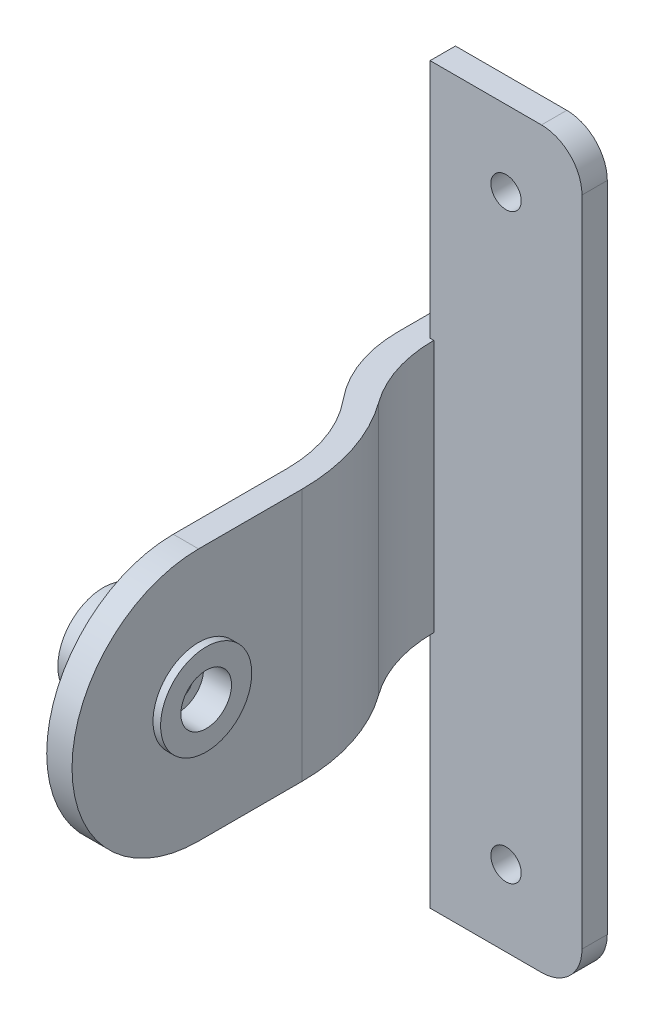
ISO-10303-21;
HEADER;
FILE_DESCRIPTION(('STEP AP214'),'2;1');
FILE_NAME('part.step','',(''),(''),'','','');
FILE_SCHEMA(('AUTOMOTIVE_DESIGN { 1 0 10303 214 1 1 1 1 }'));
ENDSEC;
DATA;
#1=APPLICATION_CONTEXT('core data for automotive mechanical design processes');
#2=APPLICATION_PROTOCOL_DEFINITION('international standard','automotive_design',2000,#1);
#3=PRODUCT_CONTEXT('',#1,'mechanical');
#4=PRODUCT('Part','Part','',(#3));
#5=PRODUCT_RELATED_PRODUCT_CATEGORY('part','',(#4));
#6=PRODUCT_DEFINITION_FORMATION('','',#4);
#7=PRODUCT_DEFINITION_CONTEXT('part definition',#1,'design');
#8=PRODUCT_DEFINITION('design','',#6,#7);
#9=PRODUCT_DEFINITION_SHAPE('','',#8);
#10=(LENGTH_UNIT() NAMED_UNIT(*) SI_UNIT(.MILLI.,.METRE.));
#11=(NAMED_UNIT(*) PLANE_ANGLE_UNIT() SI_UNIT($,.RADIAN.));
#12=(NAMED_UNIT(*) SI_UNIT($,.STERADIAN.) SOLID_ANGLE_UNIT());
#13=UNCERTAINTY_MEASURE_WITH_UNIT(LENGTH_MEASURE(1.E-05),#10,'distance_accuracy_value','');
#14=(GEOMETRIC_REPRESENTATION_CONTEXT(3) GLOBAL_UNCERTAINTY_ASSIGNED_CONTEXT((#13)) GLOBAL_UNIT_ASSIGNED_CONTEXT((#10,
#11,#12)) REPRESENTATION_CONTEXT('',''));
#15=CARTESIAN_POINT('',(0.,0.,0.));
#16=DIRECTION('',(0.,0.,1.));
#17=DIRECTION('',(1.,0.,0.));
#18=AXIS2_PLACEMENT_3D('',#15,#16,#17);
#19=CARTESIAN_POINT('',(-16.5626357879326,-12.5,-10.229605827828));
#20=DIRECTION('',(0.,-1.,0.));
#21=DIRECTION('',(0.,0.,-1.));
#22=AXIS2_PLACEMENT_3D('',#19,#20,#21);
#23=PLANE('',#22);
#24=DIRECTION('',(-1.,0.,0.));
#25=VECTOR('',#24,1.);
#26=CARTESIAN_POINT('',(-6.22117269606802,-12.5,-31.95));
#27=LINE('',#26,#25);
#28=CARTESIAN_POINT('',(-4.08117269606801,-12.5,-31.95));
#29=VERTEX_POINT('',#28);
#30=CARTESIAN_POINT('',(-6.22117269606802,-12.5,-31.95));
#31=VERTEX_POINT('',#30);
#32=EDGE_CURVE('E12',#29,#31,#27,.T.);
#33=ORIENTED_EDGE('',*,*,#32,.F.);
#34=DIRECTION('',(0.,0.,-1.));
#35=VECTOR('',#34,1.);
#36=CARTESIAN_POINT('',(-4.08117269606801,-12.5,-29.45));
#37=LINE('',#36,#35);
#38=CARTESIAN_POINT('',(-4.08117269606801,-12.5,-29.45));
#39=VERTEX_POINT('',#38);
#40=EDGE_CURVE('E220',#39,#29,#37,.T.);
#41=ORIENTED_EDGE('',*,*,#40,.F.);
#42=DIRECTION('',(-1.,0.,0.));
#43=VECTOR('',#42,1.);
#44=CARTESIAN_POINT('',(10.918827303932,-12.5,-29.45));
#45=LINE('',#44,#43);
#46=CARTESIAN_POINT('',(-3.72117269606802,-12.5,-29.45));
#47=VERTEX_POINT('',#46);
#48=EDGE_CURVE('E193',#47,#39,#45,.T.);
#49=ORIENTED_EDGE('',*,*,#48,.F.);
#50=CARTESIAN_POINT('',(10.0176070839933,-12.5,-29.45));
#51=DIRECTION('',(0.,-1.,0.));
#52=DIRECTION('',(0.,0.,1.));
#53=AXIS2_PLACEMENT_3D('',#50,#51,#52);
#54=CIRCLE('',#53,13.7387797800613);
#55=CARTESIAN_POINT('',(-1.1154521756278,-12.5,-21.3995924720058));
#56=VERTEX_POINT('',#55);
#57=EDGE_CURVE('E320',#56,#47,#54,.T.);
#58=ORIENTED_EDGE('',*,*,#57,.F.);
#59=CARTESIAN_POINT('',(-16.5626357879326,-12.5,-10.229605827828));
#60=DIRECTION('',(0.,1.,0.));
#61=DIRECTION('',(0.,0.,-1.));
#62=AXIS2_PLACEMENT_3D('',#59,#60,#61);
#63=CIRCLE('',#62,19.0626357879326);
#64=CARTESIAN_POINT('',(2.5,-12.5,-10.229605827828));
#65=VERTEX_POINT('',#64);
#66=EDGE_CURVE('E317',#65,#56,#63,.T.);
#67=ORIENTED_EDGE('',*,*,#66,.F.);
#68=DIRECTION('',(0.,0.,-1.));
#69=VECTOR('',#68,1.);
#70=CARTESIAN_POINT('',(2.5,-12.5,-7.72960582782795));
#71=LINE('',#70,#69);
#72=CARTESIAN_POINT('',(2.5,-12.5,0.));
#73=VERTEX_POINT('',#72);
#74=EDGE_CURVE('E282',#73,#65,#71,.T.);
#75=ORIENTED_EDGE('',*,*,#74,.F.);
#76=DIRECTION('',(-1.,0.,0.));
#77=VECTOR('',#76,1.);
#78=CARTESIAN_POINT('',(2.5,-12.5,0.));
#79=LINE('',#78,#77);
#80=CARTESIAN_POINT('',(0.,-12.5,0.));
#81=VERTEX_POINT('',#80);
#82=EDGE_CURVE('E252',#73,#81,#79,.T.);
#83=ORIENTED_EDGE('',*,*,#82,.T.);
#84=DIRECTION('',(0.,0.,1.));
#85=VECTOR('',#84,1.);
#86=CARTESIAN_POINT('',(0.,-12.5,-11.229605827828));
#87=LINE('',#86,#85);
#88=CARTESIAN_POINT('',(0.,-12.5,-11.229605827828));
#89=VERTEX_POINT('',#88);
#90=EDGE_CURVE('E293',#89,#81,#87,.T.);
#91=ORIENTED_EDGE('',*,*,#90,.F.);
#92=CARTESIAN_POINT('',(-13.6359802036032,-12.5,-11.229605827828));
#93=DIRECTION('',(0.,-1.,0.));
#94=DIRECTION('',(0.,0.,-1.));
#95=AXIS2_PLACEMENT_3D('',#92,#93,#94);
#96=CIRCLE('',#95,13.6359802036032);
#97=CARTESIAN_POINT('',(-3.1484631025778,-12.5,-19.9446469160133));
#98=VERTEX_POINT('',#97);
#99=EDGE_CURVE('E330',#98,#89,#96,.T.);
#100=ORIENTED_EDGE('',*,*,#99,.F.);
#101=CARTESIAN_POINT('',(7.08671938434082,-12.5,-28.45));
#102=DIRECTION('',(0.,1.,0.));
#103=DIRECTION('',(0.,0.,-1.));
#104=AXIS2_PLACEMENT_3D('',#101,#102,#103);
#105=CIRCLE('',#104,13.3078920804088);
#106=CARTESIAN_POINT('',(-6.22117269606802,-12.5,-28.45));
#107=VERTEX_POINT('',#106);
#108=EDGE_CURVE('E327',#107,#98,#105,.T.);
#109=ORIENTED_EDGE('',*,*,#108,.F.);
#110=DIRECTION('',(0.,0.,1.));
#111=VECTOR('',#110,1.);
#112=CARTESIAN_POINT('',(-6.22117269606802,-12.5,-31.95));
#113=LINE('',#112,#111);
#114=EDGE_CURVE('E323',#31,#107,#113,.T.);
#115=ORIENTED_EDGE('',*,*,#114,.F.);
#116=EDGE_LOOP('',(#33,#41,#49,#58,#67,#75,#83,#91,#100,#109,#115));
#117=FACE_BOUND('',#116,.T.);
#118=ADVANCED_FACE('F45',(#117),#23,.T.);
#119=CARTESIAN_POINT('',(2.5,12.5,-7.72960582782795));
#120=DIRECTION('',(-1.,0.,0.));
#121=DIRECTION('',(0.,0.,1.));
#122=AXIS2_PLACEMENT_3D('',#119,#120,#121);
#123=PLANE('',#122);
#124=ORIENTED_EDGE('',*,*,#74,.T.);
#125=DIRECTION('',(0.,-1.,0.));
#126=VECTOR('',#125,1.);
#127=CARTESIAN_POINT('',(2.5,12.5,-10.229605827828));
#128=LINE('',#127,#126);
#129=CARTESIAN_POINT('',(2.5,12.5,-10.229605827828));
#130=VERTEX_POINT('',#129);
#131=EDGE_CURVE('E49',#130,#65,#128,.T.);
#132=ORIENTED_EDGE('',*,*,#131,.F.);
#133=DIRECTION('',(0.,0.,-1.));
#134=VECTOR('',#133,1.);
#135=CARTESIAN_POINT('',(2.5,12.5,-7.72960582782795));
#136=LINE('',#135,#134);
#137=CARTESIAN_POINT('',(2.5,12.5,0.));
#138=VERTEX_POINT('',#137);
#139=EDGE_CURVE('E289',#138,#130,#136,.T.);
#140=ORIENTED_EDGE('',*,*,#139,.F.);
#141=CARTESIAN_POINT('',(2.5,0.,0.));
#142=DIRECTION('',(1.,0.,0.));
#143=DIRECTION('',(0.,0.,-1.));
#144=AXIS2_PLACEMENT_3D('',#141,#142,#143);
#145=CIRCLE('',#144,12.5);
#146=EDGE_CURVE('E240',#138,#73,#145,.T.);
#147=ORIENTED_EDGE('',*,*,#146,.T.);
#148=EDGE_LOOP('',(#124,#132,#140,#147));
#149=FACE_BOUND('',#148,.T.);
#150=CARTESIAN_POINT('',(2.5,0.,0.));
#151=DIRECTION('',(1.,0.,0.));
#152=DIRECTION('',(0.,0.,-1.));
#153=AXIS2_PLACEMENT_3D('',#150,#151,#152);
#154=CIRCLE('',#153,4.5);
#155=CARTESIAN_POINT('',(2.5,0.,-4.5));
#156=VERTEX_POINT('',#155);
#157=EDGE_CURVE('E278',#156,#156,#154,.T.);
#158=ORIENTED_EDGE('',*,*,#157,.F.);
#159=EDGE_LOOP('',(#158));
#160=FACE_BOUND('',#159,.T.);
#161=ADVANCED_FACE('F47',(#149,#160),#123,.F.);
#162=CARTESIAN_POINT('',(-16.5626357879326,12.5,-10.229605827828));
#163=DIRECTION('',(0.,-1.,0.));
#164=DIRECTION('',(0.,0.,-1.));
#165=AXIS2_PLACEMENT_3D('',#162,#163,#164);
#166=CYLINDRICAL_SURFACE('',#165,19.0626357879326);
#167=ORIENTED_EDGE('',*,*,#66,.T.);
#168=DIRECTION('',(0.,-1.,0.));
#169=VECTOR('',#168,1.);
#170=CARTESIAN_POINT('',(-1.1154521756278,12.5,-21.3995924720058));
#171=LINE('',#170,#169);
#172=CARTESIAN_POINT('',(-1.1154521756278,12.5,-21.3995924720058));
#173=VERTEX_POINT('',#172);
#174=EDGE_CURVE('E353',#173,#56,#171,.T.);
#175=ORIENTED_EDGE('',*,*,#174,.F.);
#176=CARTESIAN_POINT('',(-16.5626357879326,12.5,-10.229605827828));
#177=DIRECTION('',(0.,1.,0.));
#178=DIRECTION('',(0.,0.,-1.));
#179=AXIS2_PLACEMENT_3D('',#176,#177,#178);
#180=CIRCLE('',#179,19.0626357879326);
#181=EDGE_CURVE('E292',#130,#173,#180,.T.);
#182=ORIENTED_EDGE('',*,*,#181,.F.);
#183=ORIENTED_EDGE('',*,*,#131,.T.);
#184=EDGE_LOOP('',(#167,#175,#182,#183));
#185=FACE_BOUND('',#184,.T.);
#186=ADVANCED_FACE('F365',(#185),#166,.T.);
#187=CARTESIAN_POINT('',(10.0176070839933,12.5,-29.45));
#188=DIRECTION('',(0.,-1.,0.));
#189=DIRECTION('',(0.,0.,-1.));
#190=AXIS2_PLACEMENT_3D('',#187,#188,#189);
#191=CYLINDRICAL_SURFACE('',#190,13.7387797800613);
#192=ORIENTED_EDGE('',*,*,#57,.T.);
#193=DIRECTION('',(0.,-1.,0.));
#194=VECTOR('',#193,1.);
#195=CARTESIAN_POINT('',(-3.72117269606802,12.5,-29.45));
#196=LINE('',#195,#194);
#197=CARTESIAN_POINT('',(-3.72117269606802,12.5,-29.45));
#198=VERTEX_POINT('',#197);
#199=EDGE_CURVE('E350',#198,#47,#196,.T.);
#200=ORIENTED_EDGE('',*,*,#199,.F.);
#201=CARTESIAN_POINT('',(10.0176070839933,12.5,-29.45));
#202=DIRECTION('',(0.,-1.,0.));
#203=DIRECTION('',(0.,0.,1.));
#204=AXIS2_PLACEMENT_3D('',#201,#202,#203);
#205=CIRCLE('',#204,13.7387797800613);
#206=EDGE_CURVE('E296',#173,#198,#205,.T.);
#207=ORIENTED_EDGE('',*,*,#206,.F.);
#208=ORIENTED_EDGE('',*,*,#174,.T.);
#209=EDGE_LOOP('',(#192,#200,#207,#208));
#210=FACE_BOUND('',#209,.T.);
#211=ADVANCED_FACE('F376',(#210),#191,.F.);
#212=CARTESIAN_POINT('',(-6.22117269606802,12.5,-31.95));
#213=DIRECTION('',(0.,0.,1.));
#214=DIRECTION('',(1.,0.,0.));
#215=AXIS2_PLACEMENT_3D('',#212,#213,#214);
#216=PLANE('',#215);
#217=CARTESIAN_POINT('',(3.41882730393199,-28.7500000000001,-31.95));
#218=DIRECTION('',(0.,0.,1.));
#219=DIRECTION('',(-1.,0.,0.));
#220=AXIS2_PLACEMENT_3D('',#217,#218,#219);
#221=CIRCLE('',#220,1.5);
#222=CARTESIAN_POINT('',(1.91882730393199,-28.7500000000001,-31.95));
#223=VERTEX_POINT('',#222);
#224=EDGE_CURVE('E449',#223,#223,#221,.T.);
#225=ORIENTED_EDGE('',*,*,#224,.T.);
#226=EDGE_LOOP('',(#225));
#227=FACE_BOUND('',#226,.T.);
#228=CARTESIAN_POINT('',(3.41882730393199,28.7500000000001,-31.95));
#229=DIRECTION('',(0.,0.,-1.));
#230=DIRECTION('',(-1.,0.,0.));
#231=AXIS2_PLACEMENT_3D('',#228,#229,#230);
#232=CIRCLE('',#231,1.5);
#233=CARTESIAN_POINT('',(1.91882730393199,28.7500000000001,-31.95));
#234=VERTEX_POINT('',#233);
#235=EDGE_CURVE('E440',#234,#234,#232,.T.);
#236=ORIENTED_EDGE('',*,*,#235,.F.);
#237=EDGE_LOOP('',(#236));
#238=FACE_BOUND('',#237,.T.);
#239=DIRECTION('',(0.,-1.,0.));
#240=VECTOR('',#239,1.);
#241=CARTESIAN_POINT('',(10.918827303932,12.5,-31.95));
#242=LINE('',#241,#240);
#243=CARTESIAN_POINT('',(10.918827303932,32.25,-31.95));
#244=VERTEX_POINT('',#243);
#245=CARTESIAN_POINT('',(10.918827303932,-32.25,-31.95));
#246=VERTEX_POINT('',#245);
#247=EDGE_CURVE('E174',#244,#246,#242,.T.);
#248=ORIENTED_EDGE('',*,*,#247,.T.);
#249=CARTESIAN_POINT('',(6.91882730393198,-32.25,-31.95));
#250=DIRECTION('',(0.,0.,1.));
#251=DIRECTION('',(-1.,0.,0.));
#252=AXIS2_PLACEMENT_3D('',#249,#250,#251);
#253=CIRCLE('',#252,4.);
#254=CARTESIAN_POINT('',(6.91882730393198,-36.25,-31.95));
#255=VERTEX_POINT('',#254);
#256=EDGE_CURVE('E190',#255,#246,#253,.T.);
#257=ORIENTED_EDGE('',*,*,#256,.F.);
#258=DIRECTION('',(1.,0.,0.));
#259=VECTOR('',#258,1.);
#260=CARTESIAN_POINT('',(-4.08117269606801,-36.25,-31.95));
#261=LINE('',#260,#259);
#262=CARTESIAN_POINT('',(-4.08117269606801,-36.25,-31.95));
#263=VERTEX_POINT('',#262);
#264=EDGE_CURVE('E417',#263,#255,#261,.T.);
#265=ORIENTED_EDGE('',*,*,#264,.F.);
#266=DIRECTION('',(0.,-1.,0.));
#267=VECTOR('',#266,1.);
#268=CARTESIAN_POINT('',(-4.08117269606801,-12.5,-31.95));
#269=LINE('',#268,#267);
#270=EDGE_CURVE('E185',#29,#263,#269,.T.);
#271=ORIENTED_EDGE('',*,*,#270,.F.);
#272=ORIENTED_EDGE('',*,*,#32,.T.);
#273=DIRECTION('',(0.,-1.,0.));
#274=VECTOR('',#273,1.);
#275=CARTESIAN_POINT('',(-6.22117269606802,12.5,-31.95));
#276=LINE('',#275,#274);
#277=CARTESIAN_POINT('',(-6.22117269606802,12.5,-31.95));
#278=VERTEX_POINT('',#277);
#279=EDGE_CURVE('E346',#278,#31,#276,.T.);
#280=ORIENTED_EDGE('',*,*,#279,.F.);
#281=DIRECTION('',(-1.,0.,0.));
#282=VECTOR('',#281,1.);
#283=CARTESIAN_POINT('',(-6.22117269606802,12.5,-31.95));
#284=LINE('',#283,#282);
#285=CARTESIAN_POINT('',(-4.08117269606801,12.5,-31.95));
#286=VERTEX_POINT('',#285);
#287=EDGE_CURVE('E299',#286,#278,#284,.T.);
#288=ORIENTED_EDGE('',*,*,#287,.F.);
#289=DIRECTION('',(0.,1.,0.));
#290=VECTOR('',#289,1.);
#291=CARTESIAN_POINT('',(-4.08117269606801,28.75,-31.95));
#292=LINE('',#291,#290);
#293=CARTESIAN_POINT('',(-4.08117269606801,36.25,-31.95));
#294=VERTEX_POINT('',#293);
#295=EDGE_CURVE('E215',#286,#294,#292,.T.);
#296=ORIENTED_EDGE('',*,*,#295,.T.);
#297=DIRECTION('',(1.,0.,0.));
#298=VECTOR('',#297,1.);
#299=CARTESIAN_POINT('',(3.67882730393198,36.25,-31.95));
#300=LINE('',#299,#298);
#301=CARTESIAN_POINT('',(6.91882730393198,36.25,-31.95));
#302=VERTEX_POINT('',#301);
#303=EDGE_CURVE('E219',#294,#302,#300,.T.);
#304=ORIENTED_EDGE('',*,*,#303,.T.);
#305=CARTESIAN_POINT('',(6.91882730393198,32.25,-31.95));
#306=DIRECTION('',(0.,0.,-1.));
#307=DIRECTION('',(-1.,0.,0.));
#308=AXIS2_PLACEMENT_3D('',#305,#306,#307);
#309=CIRCLE('',#308,4.);
#310=EDGE_CURVE('E206',#302,#244,#309,.T.);
#311=ORIENTED_EDGE('',*,*,#310,.T.);
#312=EDGE_LOOP('',(#248,#257,#265,#271,#272,#280,#288,#296,#304,#311));
#313=FACE_BOUND('',#312,.T.);
#314=ADVANCED_FACE('F389',(#227,#238,#313),#216,.F.);
#315=CARTESIAN_POINT('',(-6.22117269606802,12.5,-31.95));
#316=DIRECTION('',(1.,0.,0.));
#317=DIRECTION('',(0.,0.,-1.));
#318=AXIS2_PLACEMENT_3D('',#315,#316,#317);
#319=PLANE('',#318);
#320=ORIENTED_EDGE('',*,*,#114,.T.);
#321=DIRECTION('',(0.,-1.,0.));
#322=VECTOR('',#321,1.);
#323=CARTESIAN_POINT('',(-6.22117269606802,12.5,-28.45));
#324=LINE('',#323,#322);
#325=CARTESIAN_POINT('',(-6.22117269606802,12.5,-28.45));
#326=VERTEX_POINT('',#325);
#327=EDGE_CURVE('E342',#326,#107,#324,.T.);
#328=ORIENTED_EDGE('',*,*,#327,.F.);
#329=DIRECTION('',(0.,0.,1.));
#330=VECTOR('',#329,1.);
#331=CARTESIAN_POINT('',(-6.22117269606802,12.5,-31.95));
#332=LINE('',#331,#330);
#333=EDGE_CURVE('E302',#278,#326,#332,.T.);
#334=ORIENTED_EDGE('',*,*,#333,.F.);
#335=ORIENTED_EDGE('',*,*,#279,.T.);
#336=EDGE_LOOP('',(#320,#328,#334,#335));
#337=FACE_BOUND('',#336,.T.);
#338=ADVANCED_FACE('F397',(#337),#319,.F.);
#339=CARTESIAN_POINT('',(7.08671938434082,12.5,-28.45));
#340=DIRECTION('',(0.,-1.,0.));
#341=DIRECTION('',(0.,0.,-1.));
#342=AXIS2_PLACEMENT_3D('',#339,#340,#341);
#343=CYLINDRICAL_SURFACE('',#342,13.3078920804088);
#344=ORIENTED_EDGE('',*,*,#108,.T.);
#345=DIRECTION('',(0.,-1.,0.));
#346=VECTOR('',#345,1.);
#347=CARTESIAN_POINT('',(-3.1484631025778,12.5,-19.9446469160133));
#348=LINE('',#347,#346);
#349=CARTESIAN_POINT('',(-3.1484631025778,12.5,-19.9446469160133));
#350=VERTEX_POINT('',#349);
#351=EDGE_CURVE('E338',#350,#98,#348,.T.);
#352=ORIENTED_EDGE('',*,*,#351,.F.);
#353=CARTESIAN_POINT('',(7.08671938434082,12.5,-28.45));
#354=DIRECTION('',(0.,1.,0.));
#355=DIRECTION('',(0.,0.,-1.));
#356=AXIS2_PLACEMENT_3D('',#353,#354,#355);
#357=CIRCLE('',#356,13.3078920804088);
#358=EDGE_CURVE('E305',#326,#350,#357,.T.);
#359=ORIENTED_EDGE('',*,*,#358,.F.);
#360=ORIENTED_EDGE('',*,*,#327,.T.);
#361=EDGE_LOOP('',(#344,#352,#359,#360));
#362=FACE_BOUND('',#361,.T.);
#363=ADVANCED_FACE('F401',(#362),#343,.T.);
#364=CARTESIAN_POINT('',(-13.6359802036032,12.5,-11.229605827828));
#365=DIRECTION('',(0.,-1.,0.));
#366=DIRECTION('',(0.,0.,-1.));
#367=AXIS2_PLACEMENT_3D('',#364,#365,#366);
#368=CYLINDRICAL_SURFACE('',#367,13.6359802036032);
#369=ORIENTED_EDGE('',*,*,#99,.T.);
#370=DIRECTION('',(0.,-1.,0.));
#371=VECTOR('',#370,1.);
#372=CARTESIAN_POINT('',(0.,12.5,-11.229605827828));
#373=LINE('',#372,#371);
#374=CARTESIAN_POINT('',(0.,12.5,-11.229605827828));
#375=VERTEX_POINT('',#374);
#376=EDGE_CURVE('E314',#375,#89,#373,.T.);
#377=ORIENTED_EDGE('',*,*,#376,.F.);
#378=CARTESIAN_POINT('',(-13.6359802036032,12.5,-11.229605827828));
#379=DIRECTION('',(0.,-1.,0.));
#380=DIRECTION('',(0.,0.,-1.));
#381=AXIS2_PLACEMENT_3D('',#378,#379,#380);
#382=CIRCLE('',#381,13.6359802036032);
#383=EDGE_CURVE('E308',#350,#375,#382,.T.);
#384=ORIENTED_EDGE('',*,*,#383,.F.);
#385=ORIENTED_EDGE('',*,*,#351,.T.);
#386=EDGE_LOOP('',(#369,#377,#384,#385));
#387=FACE_BOUND('',#386,.T.);
#388=ADVANCED_FACE('F406',(#387),#368,.F.);
#389=CARTESIAN_POINT('',(0.,12.5,-11.229605827828));
#390=DIRECTION('',(1.,0.,0.));
#391=DIRECTION('',(0.,0.,-1.));
#392=AXIS2_PLACEMENT_3D('',#389,#390,#391);
#393=PLANE('',#392);
#394=CARTESIAN_POINT('',(0.,0.,0.));
#395=DIRECTION('',(1.,0.,0.));
#396=DIRECTION('',(0.,0.,-1.));
#397=AXIS2_PLACEMENT_3D('',#394,#395,#396);
#398=CIRCLE('',#397,12.5);
#399=CARTESIAN_POINT('',(0.,12.5,0.));
#400=VERTEX_POINT('',#399);
#401=EDGE_CURVE('E245',#400,#81,#398,.T.);
#402=ORIENTED_EDGE('',*,*,#401,.F.);
#403=DIRECTION('',(0.,0.,1.));
#404=VECTOR('',#403,1.);
#405=CARTESIAN_POINT('',(0.,12.5,-11.229605827828));
#406=LINE('',#405,#404);
#407=EDGE_CURVE('E311',#375,#400,#406,.T.);
#408=ORIENTED_EDGE('',*,*,#407,.F.);
#409=ORIENTED_EDGE('',*,*,#376,.T.);
#410=ORIENTED_EDGE('',*,*,#90,.T.);
#411=EDGE_LOOP('',(#402,#408,#409,#410));
#412=FACE_BOUND('',#411,.T.);
#413=CARTESIAN_POINT('',(0.,0.,0.));
#414=DIRECTION('',(1.,0.,0.));
#415=DIRECTION('',(0.,0.,-1.));
#416=AXIS2_PLACEMENT_3D('',#413,#414,#415);
#417=CIRCLE('',#416,4.5);
#418=CARTESIAN_POINT('',(0.,0.,-4.5));
#419=VERTEX_POINT('',#418);
#420=EDGE_CURVE('E247',#419,#419,#417,.T.);
#421=ORIENTED_EDGE('',*,*,#420,.T.);
#422=EDGE_LOOP('',(#421));
#423=FACE_BOUND('',#422,.T.);
#424=ADVANCED_FACE('F412',(#412,#423),#393,.F.);
#425=CARTESIAN_POINT('',(-16.5626357879326,12.5,-10.229605827828));
#426=DIRECTION('',(0.,-1.,0.));
#427=DIRECTION('',(0.,0.,-1.));
#428=AXIS2_PLACEMENT_3D('',#425,#426,#427);
#429=PLANE('',#428);
#430=DIRECTION('',(-1.,0.,0.));
#431=VECTOR('',#430,1.);
#432=CARTESIAN_POINT('',(10.918827303932,12.5,-29.45));
#433=LINE('',#432,#431);
#434=CARTESIAN_POINT('',(-4.08117269606801,12.5,-29.45));
#435=VERTEX_POINT('',#434);
#436=EDGE_CURVE('E62',#198,#435,#433,.T.);
#437=ORIENTED_EDGE('',*,*,#436,.T.);
#438=DIRECTION('',(0.,0.,-1.));
#439=VECTOR('',#438,1.);
#440=CARTESIAN_POINT('',(-4.08117269606801,12.5,-29.45));
#441=LINE('',#440,#439);
#442=EDGE_CURVE('E66',#435,#286,#441,.T.);
#443=ORIENTED_EDGE('',*,*,#442,.T.);
#444=ORIENTED_EDGE('',*,*,#287,.T.);
#445=ORIENTED_EDGE('',*,*,#333,.T.);
#446=ORIENTED_EDGE('',*,*,#358,.T.);
#447=ORIENTED_EDGE('',*,*,#383,.T.);
#448=ORIENTED_EDGE('',*,*,#407,.T.);
#449=DIRECTION('',(-1.,0.,0.));
#450=VECTOR('',#449,1.);
#451=CARTESIAN_POINT('',(2.5,12.5,0.));
#452=LINE('',#451,#450);
#453=EDGE_CURVE('E256',#138,#400,#452,.T.);
#454=ORIENTED_EDGE('',*,*,#453,.F.);
#455=ORIENTED_EDGE('',*,*,#139,.T.);
#456=ORIENTED_EDGE('',*,*,#181,.T.);
#457=ORIENTED_EDGE('',*,*,#206,.T.);
#458=EDGE_LOOP('',(#437,#443,#444,#445,#446,#447,#448,#454,#455,#456,#457));
#459=FACE_BOUND('',#458,.T.);
#460=ADVANCED_FACE('F392',(#459),#429,.F.);
#461=CARTESIAN_POINT('',(2.5,0.,0.));
#462=DIRECTION('',(-1.,0.,0.));
#463=DIRECTION('',(0.,0.,1.));
#464=AXIS2_PLACEMENT_3D('',#461,#462,#463);
#465=CYLINDRICAL_SURFACE('',#464,1.5);
#466=CARTESIAN_POINT('',(-6.9,0.,0.));
#467=DIRECTION('',(-1.,0.,0.));
#468=DIRECTION('',(0.,0.,1.));
#469=AXIS2_PLACEMENT_3D('',#466,#467,#468);
#470=CIRCLE('',#469,1.5);
#471=CARTESIAN_POINT('',(-6.9,0.,1.5));
#472=VERTEX_POINT('',#471);
#473=EDGE_CURVE('E246',#472,#472,#470,.T.);
#474=ORIENTED_EDGE('',*,*,#473,.T.);
#475=EDGE_LOOP('',(#474));
#476=FACE_BOUND('',#475,.T.);
#477=CARTESIAN_POINT('',(0.5,0.,0.));
#478=DIRECTION('',(1.,0.,0.));
#479=DIRECTION('',(0.,0.,-1.));
#480=AXIS2_PLACEMENT_3D('',#477,#478,#479);
#481=CIRCLE('',#480,1.5);
#482=CARTESIAN_POINT('',(0.5,0.,-1.5));
#483=VERTEX_POINT('',#482);
#484=EDGE_CURVE('E241',#483,#483,#481,.T.);
#485=ORIENTED_EDGE('',*,*,#484,.T.);
#486=EDGE_LOOP('',(#485));
#487=FACE_BOUND('',#486,.T.);
#488=ADVANCED_FACE('F531',(#476,#487),#465,.F.);
#489=CARTESIAN_POINT('',(2.5,0.,0.));
#490=DIRECTION('',(-1.,0.,0.));
#491=DIRECTION('',(0.,0.,1.));
#492=AXIS2_PLACEMENT_3D('',#489,#490,#491);
#493=CYLINDRICAL_SURFACE('',#492,12.5);
#494=ORIENTED_EDGE('',*,*,#401,.T.);
#495=ORIENTED_EDGE('',*,*,#82,.F.);
#496=ORIENTED_EDGE('',*,*,#146,.F.);
#497=ORIENTED_EDGE('',*,*,#453,.T.);
#498=EDGE_LOOP('',(#494,#495,#496,#497));
#499=FACE_BOUND('',#498,.T.);
#500=ADVANCED_FACE('F411',(#499),#493,.T.);
#501=CARTESIAN_POINT('',(15.2279220613579,0.,0.));
#502=DIRECTION('',(-1.,0.,0.));
#503=DIRECTION('',(0.,0.,1.));
#504=AXIS2_PLACEMENT_3D('',#501,#502,#503);
#505=CYLINDRICAL_SURFACE('',#504,4.5);
#506=CARTESIAN_POINT('',(-6.9,0.,0.));
#507=DIRECTION('',(-1.,0.,0.));
#508=DIRECTION('',(0.,0.,1.));
#509=AXIS2_PLACEMENT_3D('',#506,#507,#508);
#510=CIRCLE('',#509,4.5);
#511=CARTESIAN_POINT('',(-6.9,0.,4.5));
#512=VERTEX_POINT('',#511);
#513=EDGE_CURVE('E251',#512,#512,#510,.T.);
#514=ORIENTED_EDGE('',*,*,#513,.F.);
#515=EDGE_LOOP('',(#514));
#516=FACE_BOUND('',#515,.T.);
#517=ORIENTED_EDGE('',*,*,#420,.F.);
#518=EDGE_LOOP('',(#517));
#519=FACE_BOUND('',#518,.T.);
#520=ADVANCED_FACE('F544',(#516,#519),#505,.T.);
#521=CARTESIAN_POINT('',(-6.9,0.,0.));
#522=DIRECTION('',(-1.,0.,0.));
#523=DIRECTION('',(0.,0.,1.));
#524=AXIS2_PLACEMENT_3D('',#521,#522,#523);
#525=PLANE('',#524);
#526=ORIENTED_EDGE('',*,*,#513,.T.);
#527=EDGE_LOOP('',(#526));
#528=FACE_BOUND('',#527,.T.);
#529=ORIENTED_EDGE('',*,*,#473,.F.);
#530=EDGE_LOOP('',(#529));
#531=FACE_BOUND('',#530,.T.);
#532=ADVANCED_FACE('F551',(#528,#531),#525,.T.);
#533=CARTESIAN_POINT('',(0.5,0.,0.));
#534=DIRECTION('',(1.,0.,0.));
#535=DIRECTION('',(0.,0.,-1.));
#536=AXIS2_PLACEMENT_3D('',#533,#534,#535);
#537=CYLINDRICAL_SURFACE('',#536,2.5);
#538=CARTESIAN_POINT('',(0.5,0.,0.));
#539=DIRECTION('',(1.,0.,0.));
#540=DIRECTION('',(0.,0.,-1.));
#541=AXIS2_PLACEMENT_3D('',#538,#539,#540);
#542=CIRCLE('',#541,2.5);
#543=CARTESIAN_POINT('',(0.5,0.,-2.5));
#544=VERTEX_POINT('',#543);
#545=EDGE_CURVE('E273',#544,#544,#542,.T.);
#546=ORIENTED_EDGE('',*,*,#545,.F.);
#547=EDGE_LOOP('',(#546));
#548=FACE_BOUND('',#547,.T.);
#549=CARTESIAN_POINT('',(3.25,0.,0.));
#550=DIRECTION('',(1.,0.,0.));
#551=DIRECTION('',(0.,0.,-1.));
#552=AXIS2_PLACEMENT_3D('',#549,#550,#551);
#553=CIRCLE('',#552,2.5);
#554=CARTESIAN_POINT('',(3.25,0.,-2.5));
#555=VERTEX_POINT('',#554);
#556=EDGE_CURVE('E269',#555,#555,#553,.T.);
#557=ORIENTED_EDGE('',*,*,#556,.T.);
#558=EDGE_LOOP('',(#557));
#559=FACE_BOUND('',#558,.T.);
#560=ADVANCED_FACE('F559',(#548,#559),#537,.F.);
#561=CARTESIAN_POINT('',(0.5,0.,0.));
#562=DIRECTION('',(1.,0.,0.));
#563=DIRECTION('',(0.,0.,-1.));
#564=AXIS2_PLACEMENT_3D('',#561,#562,#563);
#565=PLANE('',#564);
#566=ORIENTED_EDGE('',*,*,#484,.F.);
#567=EDGE_LOOP('',(#566));
#568=FACE_BOUND('',#567,.T.);
#569=ORIENTED_EDGE('',*,*,#545,.T.);
#570=EDGE_LOOP('',(#569));
#571=FACE_BOUND('',#570,.T.);
#572=ADVANCED_FACE('F567',(#568,#571),#565,.T.);
#573=CARTESIAN_POINT('',(3.25,0.,0.));
#574=DIRECTION('',(1.,0.,0.));
#575=DIRECTION('',(0.,0.,-1.));
#576=AXIS2_PLACEMENT_3D('',#573,#574,#575);
#577=PLANE('',#576);
#578=CARTESIAN_POINT('',(3.25,0.,0.));
#579=DIRECTION('',(1.,0.,0.));
#580=DIRECTION('',(0.,0.,-1.));
#581=AXIS2_PLACEMENT_3D('',#578,#579,#580);
#582=CIRCLE('',#581,4.5);
#583=CARTESIAN_POINT('',(3.25,0.,-4.5));
#584=VERTEX_POINT('',#583);
#585=EDGE_CURVE('E277',#584,#584,#582,.T.);
#586=ORIENTED_EDGE('',*,*,#585,.T.);
#587=EDGE_LOOP('',(#586));
#588=FACE_BOUND('',#587,.T.);
#589=ORIENTED_EDGE('',*,*,#556,.F.);
#590=EDGE_LOOP('',(#589));
#591=FACE_BOUND('',#590,.T.);
#592=ADVANCED_FACE('F575',(#588,#591),#577,.T.);
#593=CARTESIAN_POINT('',(3.25,0.,0.));
#594=DIRECTION('',(-1.,0.,0.));
#595=DIRECTION('',(0.,0.,1.));
#596=AXIS2_PLACEMENT_3D('',#593,#594,#595);
#597=CYLINDRICAL_SURFACE('',#596,4.5);
#598=ORIENTED_EDGE('',*,*,#585,.F.);
#599=EDGE_LOOP('',(#598));
#600=FACE_BOUND('',#599,.T.);
#601=ORIENTED_EDGE('',*,*,#157,.T.);
#602=EDGE_LOOP('',(#601));
#603=FACE_BOUND('',#602,.T.);
#604=ADVANCED_FACE('F469',(#600,#603),#597,.T.);
#605=CARTESIAN_POINT('',(10.918827303932,12.5,-31.95));
#606=DIRECTION('',(-1.,0.,0.));
#607=DIRECTION('',(0.,0.,1.));
#608=AXIS2_PLACEMENT_3D('',#605,#606,#607);
#609=PLANE('',#608);
#610=DIRECTION('',(0.,-1.,0.));
#611=VECTOR('',#610,1.);
#612=CARTESIAN_POINT('',(10.918827303932,12.5,-29.45));
#613=LINE('',#612,#611);
#614=CARTESIAN_POINT('',(10.918827303932,32.25,-29.45));
#615=VERTEX_POINT('',#614);
#616=CARTESIAN_POINT('',(10.918827303932,-32.25,-29.45));
#617=VERTEX_POINT('',#616);
#618=EDGE_CURVE('E163',#615,#617,#613,.T.);
#619=ORIENTED_EDGE('',*,*,#618,.T.);
#620=DIRECTION('',(0.,0.,-1.));
#621=VECTOR('',#620,1.);
#622=CARTESIAN_POINT('',(10.918827303932,-32.25,-29.45));
#623=LINE('',#622,#621);
#624=EDGE_CURVE('E167',#617,#246,#623,.T.);
#625=ORIENTED_EDGE('',*,*,#624,.T.);
#626=ORIENTED_EDGE('',*,*,#247,.F.);
#627=DIRECTION('',(0.,0.,-1.));
#628=VECTOR('',#627,1.);
#629=CARTESIAN_POINT('',(10.918827303932,32.25,-29.45));
#630=LINE('',#629,#628);
#631=EDGE_CURVE('E169',#615,#244,#630,.T.);
#632=ORIENTED_EDGE('',*,*,#631,.F.);
#633=EDGE_LOOP('',(#619,#625,#626,#632));
#634=FACE_BOUND('',#633,.T.);
#635=ADVANCED_FACE('F165',(#634),#609,.F.);
#636=CARTESIAN_POINT('',(10.918827303932,12.5,-29.45));
#637=DIRECTION('',(0.,0.,-1.));
#638=DIRECTION('',(-1.,0.,0.));
#639=AXIS2_PLACEMENT_3D('',#636,#637,#638);
#640=PLANE('',#639);
#641=CARTESIAN_POINT('',(3.41882730393199,-28.7500000000001,-29.45));
#642=DIRECTION('',(0.,0.,1.));
#643=DIRECTION('',(-1.,0.,0.));
#644=AXIS2_PLACEMENT_3D('',#641,#642,#643);
#645=CIRCLE('',#644,1.5);
#646=CARTESIAN_POINT('',(1.91882730393199,-28.7500000000001,-29.45));
#647=VERTEX_POINT('',#646);
#648=EDGE_CURVE('E446',#647,#647,#645,.T.);
#649=ORIENTED_EDGE('',*,*,#648,.F.);
#650=EDGE_LOOP('',(#649));
#651=FACE_BOUND('',#650,.T.);
#652=CARTESIAN_POINT('',(3.41882730393199,28.7500000000001,-29.45));
#653=DIRECTION('',(0.,0.,-1.));
#654=DIRECTION('',(-1.,0.,0.));
#655=AXIS2_PLACEMENT_3D('',#652,#653,#654);
#656=CIRCLE('',#655,1.5);
#657=CARTESIAN_POINT('',(1.91882730393199,28.7500000000001,-29.45));
#658=VERTEX_POINT('',#657);
#659=EDGE_CURVE('E437',#658,#658,#656,.T.);
#660=ORIENTED_EDGE('',*,*,#659,.T.);
#661=EDGE_LOOP('',(#660));
#662=FACE_BOUND('',#661,.T.);
#663=ORIENTED_EDGE('',*,*,#436,.F.);
#664=ORIENTED_EDGE('',*,*,#199,.T.);
#665=ORIENTED_EDGE('',*,*,#48,.T.);
#666=DIRECTION('',(0.,-1.,0.));
#667=VECTOR('',#666,1.);
#668=CARTESIAN_POINT('',(-4.08117269606801,-28.75,-29.45));
#669=LINE('',#668,#667);
#670=CARTESIAN_POINT('',(-4.08117269606801,-36.25,-29.45));
#671=VERTEX_POINT('',#670);
#672=EDGE_CURVE('E199',#39,#671,#669,.T.);
#673=ORIENTED_EDGE('',*,*,#672,.T.);
#674=DIRECTION('',(1.,0.,0.));
#675=VECTOR('',#674,1.);
#676=CARTESIAN_POINT('',(3.67882730393198,-36.25,-29.45));
#677=LINE('',#676,#675);
#678=CARTESIAN_POINT('',(6.91882730393198,-36.25,-29.45));
#679=VERTEX_POINT('',#678);
#680=EDGE_CURVE('E180',#671,#679,#677,.T.);
#681=ORIENTED_EDGE('',*,*,#680,.T.);
#682=CARTESIAN_POINT('',(6.91882730393198,-32.25,-29.45));
#683=DIRECTION('',(0.,0.,1.));
#684=DIRECTION('',(-1.,0.,0.));
#685=AXIS2_PLACEMENT_3D('',#682,#683,#684);
#686=CIRCLE('',#685,4.);
#687=EDGE_CURVE('E177',#679,#617,#686,.T.);
#688=ORIENTED_EDGE('',*,*,#687,.T.);
#689=ORIENTED_EDGE('',*,*,#618,.F.);
#690=CARTESIAN_POINT('',(6.91882730393198,32.25,-29.45));
#691=DIRECTION('',(0.,0.,-1.));
#692=DIRECTION('',(-1.,0.,0.));
#693=AXIS2_PLACEMENT_3D('',#690,#691,#692);
#694=CIRCLE('',#693,4.);
#695=CARTESIAN_POINT('',(6.91882730393198,36.25,-29.45));
#696=VERTEX_POINT('',#695);
#697=EDGE_CURVE('E212',#696,#615,#694,.T.);
#698=ORIENTED_EDGE('',*,*,#697,.F.);
#699=DIRECTION('',(1.,0.,0.));
#700=VECTOR('',#699,1.);
#701=CARTESIAN_POINT('',(-4.08117269606801,36.25,-29.45));
#702=LINE('',#701,#700);
#703=CARTESIAN_POINT('',(-4.08117269606801,36.25,-29.45));
#704=VERTEX_POINT('',#703);
#705=EDGE_CURVE('E209',#704,#696,#702,.T.);
#706=ORIENTED_EDGE('',*,*,#705,.F.);
#707=DIRECTION('',(0.,1.,0.));
#708=VECTOR('',#707,1.);
#709=CARTESIAN_POINT('',(-4.08117269606801,12.5,-29.45));
#710=LINE('',#709,#708);
#711=EDGE_CURVE('E205',#435,#704,#710,.T.);
#712=ORIENTED_EDGE('',*,*,#711,.F.);
#713=EDGE_LOOP('',(#663,#664,#665,#673,#681,#688,#689,#698,#706,#712));
#714=FACE_BOUND('',#713,.T.);
#715=ADVANCED_FACE('F178',(#651,#662,#714),#640,.F.);
#716=CARTESIAN_POINT('',(6.91882730393198,32.25,-29.45));
#717=DIRECTION('',(0.,0.,-1.));
#718=DIRECTION('',(-1.,0.,0.));
#719=AXIS2_PLACEMENT_3D('',#716,#717,#718);
#720=CYLINDRICAL_SURFACE('',#719,4.);
#721=ORIENTED_EDGE('',*,*,#310,.F.);
#722=DIRECTION('',(0.,0.,-1.));
#723=VECTOR('',#722,1.);
#724=CARTESIAN_POINT('',(6.91882730393198,36.25,-29.45));
#725=LINE('',#724,#723);
#726=EDGE_CURVE('E229',#696,#302,#725,.T.);
#727=ORIENTED_EDGE('',*,*,#726,.F.);
#728=ORIENTED_EDGE('',*,*,#697,.T.);
#729=ORIENTED_EDGE('',*,*,#631,.T.);
#730=EDGE_LOOP('',(#721,#727,#728,#729));
#731=FACE_BOUND('',#730,.T.);
#732=ADVANCED_FACE('F461',(#731),#720,.T.);
#733=CARTESIAN_POINT('',(3.67882730393198,36.25,-29.45));
#734=DIRECTION('',(0.,1.,0.));
#735=DIRECTION('',(-1.,0.,0.));
#736=AXIS2_PLACEMENT_3D('',#733,#734,#735);
#737=PLANE('',#736);
#738=ORIENTED_EDGE('',*,*,#303,.F.);
#739=DIRECTION('',(0.,0.,-1.));
#740=VECTOR('',#739,1.);
#741=CARTESIAN_POINT('',(-4.08117269606801,36.25,-29.45));
#742=LINE('',#741,#740);
#743=EDGE_CURVE('E232',#704,#294,#742,.T.);
#744=ORIENTED_EDGE('',*,*,#743,.F.);
#745=ORIENTED_EDGE('',*,*,#705,.T.);
#746=ORIENTED_EDGE('',*,*,#726,.T.);
#747=EDGE_LOOP('',(#738,#744,#745,#746));
#748=FACE_BOUND('',#747,.T.);
#749=ADVANCED_FACE('F385',(#748),#737,.T.);
#750=CARTESIAN_POINT('',(-4.08117269606801,28.75,-29.45));
#751=DIRECTION('',(-1.,0.,0.));
#752=DIRECTION('',(0.,0.,1.));
#753=AXIS2_PLACEMENT_3D('',#750,#751,#752);
#754=PLANE('',#753);
#755=ORIENTED_EDGE('',*,*,#295,.F.);
#756=ORIENTED_EDGE('',*,*,#442,.F.);
#757=ORIENTED_EDGE('',*,*,#711,.T.);
#758=ORIENTED_EDGE('',*,*,#743,.T.);
#759=EDGE_LOOP('',(#755,#756,#757,#758));
#760=FACE_BOUND('',#759,.T.);
#761=ADVANCED_FACE('F383',(#760),#754,.T.);
#762=CARTESIAN_POINT('',(-4.08117269606801,-12.5,-29.45));
#763=DIRECTION('',(1.,0.,0.));
#764=DIRECTION('',(0.,1.,0.));
#765=AXIS2_PLACEMENT_3D('',#762,#763,#764);
#766=PLANE('',#765);
#767=ORIENTED_EDGE('',*,*,#270,.T.);
#768=DIRECTION('',(0.,0.,-1.));
#769=VECTOR('',#768,1.);
#770=CARTESIAN_POINT('',(-4.08117269606801,-36.25,-29.45));
#771=LINE('',#770,#769);
#772=EDGE_CURVE('E197',#671,#263,#771,.T.);
#773=ORIENTED_EDGE('',*,*,#772,.F.);
#774=ORIENTED_EDGE('',*,*,#672,.F.);
#775=ORIENTED_EDGE('',*,*,#40,.T.);
#776=EDGE_LOOP('',(#767,#773,#774,#775));
#777=FACE_BOUND('',#776,.T.);
#778=ADVANCED_FACE('F431',(#777),#766,.F.);
#779=CARTESIAN_POINT('',(-4.08117269606801,-36.25,-29.45));
#780=DIRECTION('',(0.,1.,0.));
#781=DIRECTION('',(-1.,0.,0.));
#782=AXIS2_PLACEMENT_3D('',#779,#780,#781);
#783=PLANE('',#782);
#784=ORIENTED_EDGE('',*,*,#264,.T.);
#785=DIRECTION('',(0.,0.,-1.));
#786=VECTOR('',#785,1.);
#787=CARTESIAN_POINT('',(6.91882730393198,-36.25,-29.45));
#788=LINE('',#787,#786);
#789=EDGE_CURVE('E192',#679,#255,#788,.T.);
#790=ORIENTED_EDGE('',*,*,#789,.F.);
#791=ORIENTED_EDGE('',*,*,#680,.F.);
#792=ORIENTED_EDGE('',*,*,#772,.T.);
#793=EDGE_LOOP('',(#784,#790,#791,#792));
#794=FACE_BOUND('',#793,.T.);
#795=ADVANCED_FACE('F430',(#794),#783,.F.);
#796=CARTESIAN_POINT('',(6.91882730393198,-32.25,-29.45));
#797=DIRECTION('',(0.,0.,-1.));
#798=DIRECTION('',(-1.,0.,0.));
#799=AXIS2_PLACEMENT_3D('',#796,#797,#798);
#800=CYLINDRICAL_SURFACE('',#799,4.);
#801=ORIENTED_EDGE('',*,*,#256,.T.);
#802=ORIENTED_EDGE('',*,*,#624,.F.);
#803=ORIENTED_EDGE('',*,*,#687,.F.);
#804=ORIENTED_EDGE('',*,*,#789,.T.);
#805=EDGE_LOOP('',(#801,#802,#803,#804));
#806=FACE_BOUND('',#805,.T.);
#807=ADVANCED_FACE('F188',(#806),#800,.T.);
#808=CARTESIAN_POINT('',(3.41882730393199,28.7500000000001,-29.45));
#809=DIRECTION('',(0.,0.,-1.));
#810=DIRECTION('',(-1.,0.,0.));
#811=AXIS2_PLACEMENT_3D('',#808,#809,#810);
#812=CYLINDRICAL_SURFACE('',#811,1.5);
#813=ORIENTED_EDGE('',*,*,#659,.F.);
#814=EDGE_LOOP('',(#813));
#815=FACE_BOUND('',#814,.T.);
#816=ORIENTED_EDGE('',*,*,#235,.T.);
#817=EDGE_LOOP('',(#816));
#818=FACE_BOUND('',#817,.T.);
#819=ADVANCED_FACE('F621',(#815,#818),#812,.F.);
#820=CARTESIAN_POINT('',(3.41882730393199,-28.7500000000001,-29.45));
#821=DIRECTION('',(0.,0.,-1.));
#822=DIRECTION('',(-1.,0.,0.));
#823=AXIS2_PLACEMENT_3D('',#820,#821,#822);
#824=CYLINDRICAL_SURFACE('',#823,1.5);
#825=ORIENTED_EDGE('',*,*,#648,.T.);
#826=EDGE_LOOP('',(#825));
#827=FACE_BOUND('',#826,.T.);
#828=ORIENTED_EDGE('',*,*,#224,.F.);
#829=EDGE_LOOP('',(#828));
#830=FACE_BOUND('',#829,.T.);
#831=ADVANCED_FACE('F457',(#827,#830),#824,.F.);
#832=CLOSED_SHELL('',(#118,#161,#186,#211,#314,#338,#363,#388,#424,#460,#488,#500,#520,#532,
#560,#572,#592,#604,#635,#715,#732,#749,#761,#778,#795,#807,#819,#831));
#833=MANIFOLD_SOLID_BREP('B2',#832);
#834=ADVANCED_BREP_SHAPE_REPRESENTATION('',(#18,#833),#14);
#835=SHAPE_DEFINITION_REPRESENTATION(#9,#834);
ENDSEC;
END-ISO-10303-21;
